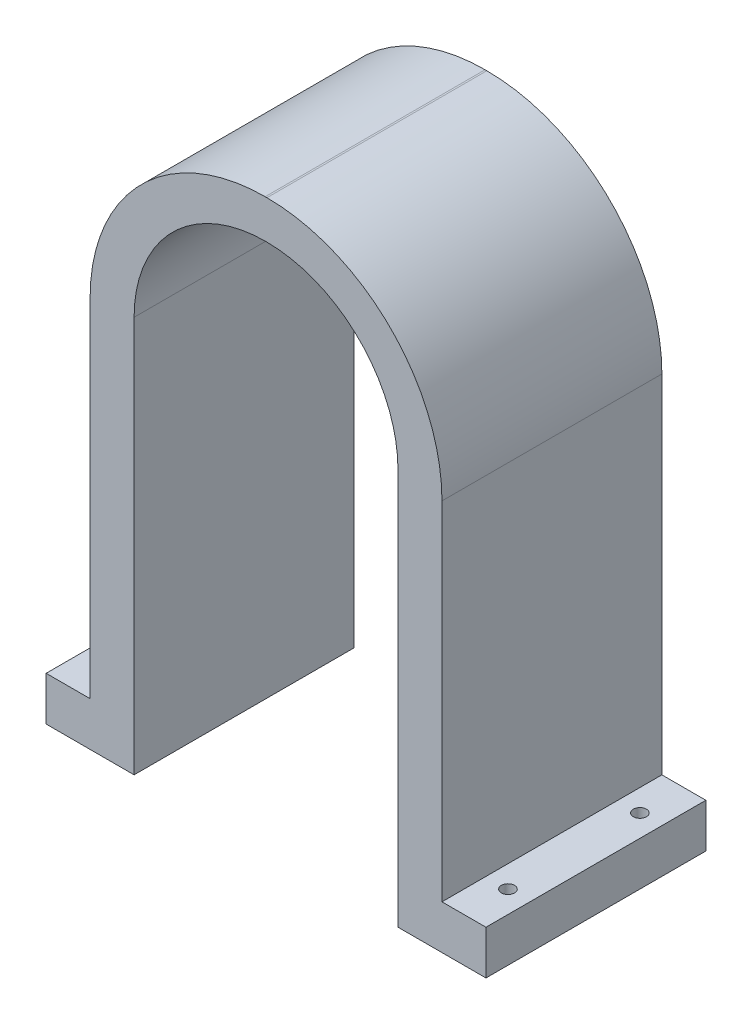
ISO-10303-21;
HEADER;
FILE_DESCRIPTION(('STEP AP214'),'2;1');
FILE_NAME('part.step','',(''),(''),'','','');
FILE_SCHEMA(('AUTOMOTIVE_DESIGN { 1 0 10303 214 1 1 1 1 }'));
ENDSEC;
DATA;
#1=APPLICATION_CONTEXT('core data for automotive mechanical design processes');
#2=APPLICATION_PROTOCOL_DEFINITION('international standard','automotive_design',2000,#1);
#3=PRODUCT_CONTEXT('',#1,'mechanical');
#4=PRODUCT('Part','Part','',(#3));
#5=PRODUCT_RELATED_PRODUCT_CATEGORY('part','',(#4));
#6=PRODUCT_DEFINITION_FORMATION('','',#4);
#7=PRODUCT_DEFINITION_CONTEXT('part definition',#1,'design');
#8=PRODUCT_DEFINITION('design','',#6,#7);
#9=PRODUCT_DEFINITION_SHAPE('','',#8);
#10=(LENGTH_UNIT() NAMED_UNIT(*) SI_UNIT(.MILLI.,.METRE.));
#11=(NAMED_UNIT(*) PLANE_ANGLE_UNIT() SI_UNIT($,.RADIAN.));
#12=(NAMED_UNIT(*) SI_UNIT($,.STERADIAN.) SOLID_ANGLE_UNIT());
#13=UNCERTAINTY_MEASURE_WITH_UNIT(LENGTH_MEASURE(1.E-05),#10,'distance_accuracy_value','');
#14=(GEOMETRIC_REPRESENTATION_CONTEXT(3) GLOBAL_UNCERTAINTY_ASSIGNED_CONTEXT((#13)) GLOBAL_UNIT_ASSIGNED_CONTEXT((#10,
#11,#12)) REPRESENTATION_CONTEXT('',''));
#15=CARTESIAN_POINT('',(0.,0.,0.));
#16=DIRECTION('',(0.,0.,1.));
#17=DIRECTION('',(1.,0.,0.));
#18=AXIS2_PLACEMENT_3D('',#15,#16,#17);
#19=CARTESIAN_POINT('',(-7.45283018867924,-1.23584905660377,50.));
#20=DIRECTION('',(0.,-1.,0.));
#21=DIRECTION('',(0.,0.,-1.));
#22=AXIS2_PLACEMENT_3D('',#19,#20,#21);
#23=PLANE('',#22);
#24=CARTESIAN_POINT('',(-2.45283018867924,-1.23584905660377,10.));
#25=DIRECTION('',(0.,1.,0.));
#26=DIRECTION('',(0.,0.,1.));
#27=AXIS2_PLACEMENT_3D('',#24,#25,#26);
#28=CIRCLE('',#27,1.5);
#29=CARTESIAN_POINT('',(-2.45283018867924,-1.23584905660377,11.5));
#30=VERTEX_POINT('',#29);
#31=EDGE_CURVE('E326',#30,#30,#28,.T.);
#32=ORIENTED_EDGE('',*,*,#31,.F.);
#33=EDGE_LOOP('',(#32));
#34=FACE_BOUND('',#33,.T.);
#35=CARTESIAN_POINT('',(-2.45283018867924,-1.23584905660377,40.));
#36=DIRECTION('',(0.,1.,0.));
#37=DIRECTION('',(0.,0.,1.));
#38=AXIS2_PLACEMENT_3D('',#35,#36,#37);
#39=CIRCLE('',#38,1.5);
#40=CARTESIAN_POINT('',(-2.45283018867924,-1.23584905660377,41.5));
#41=VERTEX_POINT('',#40);
#42=EDGE_CURVE('E262',#41,#41,#39,.T.);
#43=ORIENTED_EDGE('',*,*,#42,.F.);
#44=EDGE_LOOP('',(#43));
#45=FACE_BOUND('',#44,.T.);
#46=DIRECTION('',(-1.,0.,0.));
#47=VECTOR('',#46,1.);
#48=CARTESIAN_POINT('',(-7.45283018867924,-1.23584905660377,0.));
#49=LINE('',#48,#47);
#50=CARTESIAN_POINT('',(2.54716981132076,-1.23584905660377,0.));
#51=VERTEX_POINT('',#50);
#52=CARTESIAN_POINT('',(-7.45283018867924,-1.23584905660377,0.));
#53=VERTEX_POINT('',#52);
#54=EDGE_CURVE('E185',#51,#53,#49,.T.);
#55=ORIENTED_EDGE('',*,*,#54,.T.);
#56=DIRECTION('',(0.,0.,-1.));
#57=VECTOR('',#56,1.);
#58=CARTESIAN_POINT('',(-7.45283018867924,-1.23584905660377,50.));
#59=LINE('',#58,#57);
#60=CARTESIAN_POINT('',(-7.45283018867924,-1.23584905660377,50.));
#61=VERTEX_POINT('',#60);
#62=EDGE_CURVE('E11',#61,#53,#59,.T.);
#63=ORIENTED_EDGE('',*,*,#62,.F.);
#64=DIRECTION('',(-1.,0.,0.));
#65=VECTOR('',#64,1.);
#66=CARTESIAN_POINT('',(-7.45283018867924,-1.23584905660377,50.));
#67=LINE('',#66,#65);
#68=CARTESIAN_POINT('',(2.54716981132076,-1.23584905660377,50.));
#69=VERTEX_POINT('',#68);
#70=EDGE_CURVE('E215',#69,#61,#67,.T.);
#71=ORIENTED_EDGE('',*,*,#70,.F.);
#72=DIRECTION('',(0.,0.,-1.));
#73=VECTOR('',#72,1.);
#74=CARTESIAN_POINT('',(2.54716981132076,-1.23584905660377,50.));
#75=LINE('',#74,#73);
#76=EDGE_CURVE('E181',#69,#51,#75,.T.);
#77=ORIENTED_EDGE('',*,*,#76,.T.);
#78=EDGE_LOOP('',(#55,#63,#71,#77));
#79=FACE_BOUND('',#78,.T.);
#80=ADVANCED_FACE('F39',(#34,#45,#79),#23,.F.);
#81=CARTESIAN_POINT('',(-7.45283018867924,-1.23584905660377,50.));
#82=DIRECTION('',(1.,0.,0.));
#83=DIRECTION('',(0.,1.,0.));
#84=AXIS2_PLACEMENT_3D('',#81,#82,#83);
#85=PLANE('',#84);
#86=DIRECTION('',(0.,-1.,0.));
#87=VECTOR('',#86,1.);
#88=CARTESIAN_POINT('',(-7.45283018867924,-1.23584905660377,0.));
#89=LINE('',#88,#87);
#90=CARTESIAN_POINT('',(-7.45283018867924,-11.2358490566038,0.));
#91=VERTEX_POINT('',#90);
#92=EDGE_CURVE('E188',#53,#91,#89,.T.);
#93=ORIENTED_EDGE('',*,*,#92,.T.);
#94=DIRECTION('',(0.,0.,-1.));
#95=VECTOR('',#94,1.);
#96=CARTESIAN_POINT('',(-7.45283018867924,-11.2358490566038,50.));
#97=LINE('',#96,#95);
#98=CARTESIAN_POINT('',(-7.45283018867924,-11.2358490566038,50.));
#99=VERTEX_POINT('',#98);
#100=EDGE_CURVE('E48',#99,#91,#97,.T.);
#101=ORIENTED_EDGE('',*,*,#100,.F.);
#102=DIRECTION('',(0.,-1.,0.));
#103=VECTOR('',#102,1.);
#104=CARTESIAN_POINT('',(-7.45283018867924,-1.23584905660377,50.));
#105=LINE('',#104,#103);
#106=EDGE_CURVE('E124',#61,#99,#105,.T.);
#107=ORIENTED_EDGE('',*,*,#106,.F.);
#108=ORIENTED_EDGE('',*,*,#62,.T.);
#109=EDGE_LOOP('',(#93,#101,#107,#108));
#110=FACE_BOUND('',#109,.T.);
#111=ADVANCED_FACE('F315',(#110),#85,.F.);
#112=CARTESIAN_POINT('',(-7.45283018867924,-11.2358490566038,50.));
#113=DIRECTION('',(0.,1.,0.));
#114=DIRECTION('',(0.,0.,1.));
#115=AXIS2_PLACEMENT_3D('',#112,#113,#114);
#116=PLANE('',#115);
#117=CARTESIAN_POINT('',(-2.45283018867924,-11.2358490566038,10.));
#118=DIRECTION('',(0.,1.,0.));
#119=DIRECTION('',(0.,0.,1.));
#120=AXIS2_PLACEMENT_3D('',#117,#118,#119);
#121=CIRCLE('',#120,1.5);
#122=CARTESIAN_POINT('',(-2.45283018867924,-11.2358490566038,11.5));
#123=VERTEX_POINT('',#122);
#124=EDGE_CURVE('E42',#123,#123,#121,.T.);
#125=ORIENTED_EDGE('',*,*,#124,.T.);
#126=EDGE_LOOP('',(#125));
#127=FACE_BOUND('',#126,.T.);
#128=CARTESIAN_POINT('',(-2.45283018867924,-11.2358490566038,40.));
#129=DIRECTION('',(0.,1.,0.));
#130=DIRECTION('',(0.,0.,1.));
#131=AXIS2_PLACEMENT_3D('',#128,#129,#130);
#132=CIRCLE('',#131,1.5);
#133=CARTESIAN_POINT('',(-2.45283018867924,-11.2358490566038,41.5));
#134=VERTEX_POINT('',#133);
#135=EDGE_CURVE('E250',#134,#134,#132,.T.);
#136=ORIENTED_EDGE('',*,*,#135,.T.);
#137=EDGE_LOOP('',(#136));
#138=FACE_BOUND('',#137,.T.);
#139=DIRECTION('',(1.,0.,0.));
#140=VECTOR('',#139,1.);
#141=CARTESIAN_POINT('',(-7.45283018867924,-11.2358490566038,0.));
#142=LINE('',#141,#140);
#143=CARTESIAN_POINT('',(12.5471698113208,-11.2358490566038,0.));
#144=VERTEX_POINT('',#143);
#145=EDGE_CURVE('E190',#91,#144,#142,.T.);
#146=ORIENTED_EDGE('',*,*,#145,.T.);
#147=DIRECTION('',(0.,0.,-1.));
#148=VECTOR('',#147,1.);
#149=CARTESIAN_POINT('',(12.5471698113208,-11.2358490566038,50.));
#150=LINE('',#149,#148);
#151=CARTESIAN_POINT('',(12.5471698113208,-11.2358490566038,50.));
#152=VERTEX_POINT('',#151);
#153=EDGE_CURVE('E246',#152,#144,#150,.T.);
#154=ORIENTED_EDGE('',*,*,#153,.F.);
#155=DIRECTION('',(1.,0.,0.));
#156=VECTOR('',#155,1.);
#157=CARTESIAN_POINT('',(-7.45283018867924,-11.2358490566038,50.));
#158=LINE('',#157,#156);
#159=EDGE_CURVE('E268',#99,#152,#158,.T.);
#160=ORIENTED_EDGE('',*,*,#159,.F.);
#161=ORIENTED_EDGE('',*,*,#100,.T.);
#162=EDGE_LOOP('',(#146,#154,#160,#161));
#163=FACE_BOUND('',#162,.T.);
#164=ADVANCED_FACE('F322',(#127,#138,#163),#116,.F.);
#165=CARTESIAN_POINT('',(12.5471698113208,-11.2358490566038,50.));
#166=DIRECTION('',(-1.,0.,0.));
#167=DIRECTION('',(0.,0.,1.));
#168=AXIS2_PLACEMENT_3D('',#165,#166,#167);
#169=PLANE('',#168);
#170=DIRECTION('',(0.,1.,0.));
#171=VECTOR('',#170,1.);
#172=CARTESIAN_POINT('',(12.5471698113208,-11.2358490566038,0.));
#173=LINE('',#172,#171);
#174=CARTESIAN_POINT('',(12.5471698113208,78.8641509433962,0.));
#175=VERTEX_POINT('',#174);
#176=EDGE_CURVE('E192',#144,#175,#173,.T.);
#177=ORIENTED_EDGE('',*,*,#176,.T.);
#178=DIRECTION('',(0.,0.,-1.));
#179=VECTOR('',#178,1.);
#180=CARTESIAN_POINT('',(12.5471698113208,78.8641509433962,50.));
#181=LINE('',#180,#179);
#182=CARTESIAN_POINT('',(12.5471698113208,78.8641509433962,50.));
#183=VERTEX_POINT('',#182);
#184=EDGE_CURVE('E243',#183,#175,#181,.T.);
#185=ORIENTED_EDGE('',*,*,#184,.F.);
#186=DIRECTION('',(0.,1.,0.));
#187=VECTOR('',#186,1.);
#188=CARTESIAN_POINT('',(12.5471698113208,-11.2358490566038,50.));
#189=LINE('',#188,#187);
#190=EDGE_CURVE('E270',#152,#183,#189,.T.);
#191=ORIENTED_EDGE('',*,*,#190,.F.);
#192=ORIENTED_EDGE('',*,*,#153,.T.);
#193=EDGE_LOOP('',(#177,#185,#191,#192));
#194=FACE_BOUND('',#193,.T.);
#195=ADVANCED_FACE('F381',(#194),#169,.F.);
#196=CARTESIAN_POINT('',(42.4471698113208,78.8641509433962,50.));
#197=DIRECTION('',(0.,0.,-1.));
#198=DIRECTION('',(-1.,0.,0.));
#199=AXIS2_PLACEMENT_3D('',#196,#197,#198);
#200=CYLINDRICAL_SURFACE('',#199,29.9);
#201=CARTESIAN_POINT('',(42.4471698113208,78.8641509433962,0.));
#202=DIRECTION('',(0.,0.,-1.));
#203=DIRECTION('',(1.,0.,0.));
#204=AXIS2_PLACEMENT_3D('',#201,#202,#203);
#205=CIRCLE('',#204,29.9);
#206=CARTESIAN_POINT('',(42.4471698113208,108.764150943396,0.));
#207=VERTEX_POINT('',#206);
#208=EDGE_CURVE('E194',#175,#207,#205,.T.);
#209=ORIENTED_EDGE('',*,*,#208,.T.);
#210=DIRECTION('',(0.,0.,-1.));
#211=VECTOR('',#210,1.);
#212=CARTESIAN_POINT('',(42.4471698113208,108.764150943396,50.));
#213=LINE('',#212,#211);
#214=CARTESIAN_POINT('',(42.4471698113208,108.764150943396,50.));
#215=VERTEX_POINT('',#214);
#216=EDGE_CURVE('E240',#215,#207,#213,.T.);
#217=ORIENTED_EDGE('',*,*,#216,.F.);
#218=CARTESIAN_POINT('',(42.4471698113208,78.8641509433962,50.));
#219=DIRECTION('',(0.,0.,-1.));
#220=DIRECTION('',(1.,0.,0.));
#221=AXIS2_PLACEMENT_3D('',#218,#219,#220);
#222=CIRCLE('',#221,29.9);
#223=EDGE_CURVE('E272',#183,#215,#222,.T.);
#224=ORIENTED_EDGE('',*,*,#223,.F.);
#225=ORIENTED_EDGE('',*,*,#184,.T.);
#226=EDGE_LOOP('',(#209,#217,#224,#225));
#227=FACE_BOUND('',#226,.T.);
#228=ADVANCED_FACE('F377',(#227),#200,.F.);
#229=CARTESIAN_POINT('',(42.4471698113208,108.764150943396,50.));
#230=DIRECTION('',(0.,1.,0.));
#231=DIRECTION('',(0.,0.,1.));
#232=AXIS2_PLACEMENT_3D('',#229,#230,#231);
#233=PLANE('',#232);
#234=DIRECTION('',(1.,0.,0.));
#235=VECTOR('',#234,1.);
#236=CARTESIAN_POINT('',(42.4471698113208,108.764150943396,0.));
#237=LINE('',#236,#235);
#238=CARTESIAN_POINT('',(42.6471698113208,108.764150943396,0.));
#239=VERTEX_POINT('',#238);
#240=EDGE_CURVE('E196',#207,#239,#237,.T.);
#241=ORIENTED_EDGE('',*,*,#240,.T.);
#242=DIRECTION('',(0.,0.,-1.));
#243=VECTOR('',#242,1.);
#244=CARTESIAN_POINT('',(42.6471698113208,108.764150943396,50.));
#245=LINE('',#244,#243);
#246=CARTESIAN_POINT('',(42.6471698113208,108.764150943396,50.));
#247=VERTEX_POINT('',#246);
#248=EDGE_CURVE('E237',#247,#239,#245,.T.);
#249=ORIENTED_EDGE('',*,*,#248,.F.);
#250=DIRECTION('',(1.,0.,0.));
#251=VECTOR('',#250,1.);
#252=CARTESIAN_POINT('',(42.4471698113208,108.764150943396,50.));
#253=LINE('',#252,#251);
#254=EDGE_CURVE('E274',#215,#247,#253,.T.);
#255=ORIENTED_EDGE('',*,*,#254,.F.);
#256=ORIENTED_EDGE('',*,*,#216,.T.);
#257=EDGE_LOOP('',(#241,#249,#255,#256));
#258=FACE_BOUND('',#257,.T.);
#259=ADVANCED_FACE('F373',(#258),#233,.F.);
#260=CARTESIAN_POINT('',(42.6471698113208,78.8641509433962,50.));
#261=DIRECTION('',(0.,0.,-1.));
#262=DIRECTION('',(-1.,0.,0.));
#263=AXIS2_PLACEMENT_3D('',#260,#261,#262);
#264=CYLINDRICAL_SURFACE('',#263,29.9);
#265=CARTESIAN_POINT('',(42.6471698113208,78.8641509433962,0.));
#266=DIRECTION('',(0.,0.,-1.));
#267=DIRECTION('',(1.,0.,0.));
#268=AXIS2_PLACEMENT_3D('',#265,#266,#267);
#269=CIRCLE('',#268,29.9);
#270=CARTESIAN_POINT('',(72.5471698113208,78.8641509433962,0.));
#271=VERTEX_POINT('',#270);
#272=EDGE_CURVE('E198',#239,#271,#269,.T.);
#273=ORIENTED_EDGE('',*,*,#272,.T.);
#274=DIRECTION('',(0.,0.,-1.));
#275=VECTOR('',#274,1.);
#276=CARTESIAN_POINT('',(72.5471698113208,78.8641509433962,50.));
#277=LINE('',#276,#275);
#278=CARTESIAN_POINT('',(72.5471698113208,78.8641509433962,50.));
#279=VERTEX_POINT('',#278);
#280=EDGE_CURVE('E234',#279,#271,#277,.T.);
#281=ORIENTED_EDGE('',*,*,#280,.F.);
#282=CARTESIAN_POINT('',(42.6471698113208,78.8641509433962,50.));
#283=DIRECTION('',(0.,0.,-1.));
#284=DIRECTION('',(1.,0.,0.));
#285=AXIS2_PLACEMENT_3D('',#282,#283,#284);
#286=CIRCLE('',#285,29.9);
#287=EDGE_CURVE('E276',#247,#279,#286,.T.);
#288=ORIENTED_EDGE('',*,*,#287,.F.);
#289=ORIENTED_EDGE('',*,*,#248,.T.);
#290=EDGE_LOOP('',(#273,#281,#288,#289));
#291=FACE_BOUND('',#290,.T.);
#292=ADVANCED_FACE('F368',(#291),#264,.F.);
#293=CARTESIAN_POINT('',(72.5471698113208,-11.2358490566038,50.));
#294=DIRECTION('',(1.,0.,0.));
#295=DIRECTION('',(0.,1.,0.));
#296=AXIS2_PLACEMENT_3D('',#293,#294,#295);
#297=PLANE('',#296);
#298=DIRECTION('',(0.,-1.,0.));
#299=VECTOR('',#298,1.);
#300=CARTESIAN_POINT('',(72.5471698113208,-11.2358490566038,0.));
#301=LINE('',#300,#299);
#302=CARTESIAN_POINT('',(72.5471698113208,-11.2358490566038,0.));
#303=VERTEX_POINT('',#302);
#304=EDGE_CURVE('E200',#271,#303,#301,.T.);
#305=ORIENTED_EDGE('',*,*,#304,.T.);
#306=DIRECTION('',(0.,0.,-1.));
#307=VECTOR('',#306,1.);
#308=CARTESIAN_POINT('',(72.5471698113208,-11.2358490566038,50.));
#309=LINE('',#308,#307);
#310=CARTESIAN_POINT('',(72.5471698113208,-11.2358490566038,50.));
#311=VERTEX_POINT('',#310);
#312=EDGE_CURVE('E231',#311,#303,#309,.T.);
#313=ORIENTED_EDGE('',*,*,#312,.F.);
#314=DIRECTION('',(0.,-1.,0.));
#315=VECTOR('',#314,1.);
#316=CARTESIAN_POINT('',(72.5471698113208,-11.2358490566038,50.));
#317=LINE('',#316,#315);
#318=EDGE_CURVE('E278',#279,#311,#317,.T.);
#319=ORIENTED_EDGE('',*,*,#318,.F.);
#320=ORIENTED_EDGE('',*,*,#280,.T.);
#321=EDGE_LOOP('',(#305,#313,#319,#320));
#322=FACE_BOUND('',#321,.T.);
#323=ADVANCED_FACE('F362',(#322),#297,.F.);
#324=CARTESIAN_POINT('',(92.5471698113208,-11.2358490566038,50.));
#325=DIRECTION('',(0.,1.,0.));
#326=DIRECTION('',(-1.,0.,0.));
#327=AXIS2_PLACEMENT_3D('',#324,#325,#326);
#328=PLANE('',#327);
#329=CARTESIAN_POINT('',(87.5471698113208,-11.2358490566038,40.));
#330=DIRECTION('',(0.,1.,0.));
#331=DIRECTION('',(-1.,0.,0.));
#332=AXIS2_PLACEMENT_3D('',#329,#330,#331);
#333=CIRCLE('',#332,1.5);
#334=CARTESIAN_POINT('',(86.0471698113208,-11.2358490566038,40.));
#335=VERTEX_POINT('',#334);
#336=EDGE_CURVE('E252',#335,#335,#333,.T.);
#337=ORIENTED_EDGE('',*,*,#336,.T.);
#338=EDGE_LOOP('',(#337));
#339=FACE_BOUND('',#338,.T.);
#340=CARTESIAN_POINT('',(87.5471698113208,-11.2358490566038,10.));
#341=DIRECTION('',(0.,1.,0.));
#342=DIRECTION('',(-1.,0.,0.));
#343=AXIS2_PLACEMENT_3D('',#340,#341,#342);
#344=CIRCLE('',#343,1.5);
#345=CARTESIAN_POINT('',(86.0471698113208,-11.2358490566038,10.));
#346=VERTEX_POINT('',#345);
#347=EDGE_CURVE('E257',#346,#346,#344,.T.);
#348=ORIENTED_EDGE('',*,*,#347,.T.);
#349=EDGE_LOOP('',(#348));
#350=FACE_BOUND('',#349,.T.);
#351=DIRECTION('',(1.,0.,0.));
#352=VECTOR('',#351,1.);
#353=CARTESIAN_POINT('',(92.5471698113208,-11.2358490566038,0.));
#354=LINE('',#353,#352);
#355=CARTESIAN_POINT('',(92.5471698113208,-11.2358490566038,0.));
#356=VERTEX_POINT('',#355);
#357=EDGE_CURVE('E202',#303,#356,#354,.T.);
#358=ORIENTED_EDGE('',*,*,#357,.T.);
#359=DIRECTION('',(0.,0.,-1.));
#360=VECTOR('',#359,1.);
#361=CARTESIAN_POINT('',(92.5471698113208,-11.2358490566038,50.));
#362=LINE('',#361,#360);
#363=CARTESIAN_POINT('',(92.5471698113208,-11.2358490566038,50.));
#364=VERTEX_POINT('',#363);
#365=EDGE_CURVE('E228',#364,#356,#362,.T.);
#366=ORIENTED_EDGE('',*,*,#365,.F.);
#367=DIRECTION('',(1.,0.,0.));
#368=VECTOR('',#367,1.);
#369=CARTESIAN_POINT('',(92.5471698113208,-11.2358490566038,50.));
#370=LINE('',#369,#368);
#371=EDGE_CURVE('E280',#311,#364,#370,.T.);
#372=ORIENTED_EDGE('',*,*,#371,.F.);
#373=ORIENTED_EDGE('',*,*,#312,.T.);
#374=EDGE_LOOP('',(#358,#366,#372,#373));
#375=FACE_BOUND('',#374,.T.);
#376=ADVANCED_FACE('F358',(#339,#350,#375),#328,.F.);
#377=CARTESIAN_POINT('',(92.5471698113208,-1.23584905660377,50.));
#378=DIRECTION('',(-1.,0.,0.));
#379=DIRECTION('',(0.,0.,1.));
#380=AXIS2_PLACEMENT_3D('',#377,#378,#379);
#381=PLANE('',#380);
#382=DIRECTION('',(0.,1.,0.));
#383=VECTOR('',#382,1.);
#384=CARTESIAN_POINT('',(92.5471698113208,-1.23584905660377,0.));
#385=LINE('',#384,#383);
#386=CARTESIAN_POINT('',(92.5471698113208,-1.23584905660377,0.));
#387=VERTEX_POINT('',#386);
#388=EDGE_CURVE('E204',#356,#387,#385,.T.);
#389=ORIENTED_EDGE('',*,*,#388,.T.);
#390=DIRECTION('',(0.,0.,-1.));
#391=VECTOR('',#390,1.);
#392=CARTESIAN_POINT('',(92.5471698113208,-1.23584905660377,50.));
#393=LINE('',#392,#391);
#394=CARTESIAN_POINT('',(92.5471698113208,-1.23584905660377,50.));
#395=VERTEX_POINT('',#394);
#396=EDGE_CURVE('E225',#395,#387,#393,.T.);
#397=ORIENTED_EDGE('',*,*,#396,.F.);
#398=DIRECTION('',(0.,1.,0.));
#399=VECTOR('',#398,1.);
#400=CARTESIAN_POINT('',(92.5471698113208,-1.23584905660377,50.));
#401=LINE('',#400,#399);
#402=EDGE_CURVE('E282',#364,#395,#401,.T.);
#403=ORIENTED_EDGE('',*,*,#402,.F.);
#404=ORIENTED_EDGE('',*,*,#365,.T.);
#405=EDGE_LOOP('',(#389,#397,#403,#404));
#406=FACE_BOUND('',#405,.T.);
#407=ADVANCED_FACE('F345',(#406),#381,.F.);
#408=CARTESIAN_POINT('',(82.5471698113208,-1.23584905660377,50.));
#409=DIRECTION('',(0.,-1.,0.));
#410=DIRECTION('',(0.,0.,-1.));
#411=AXIS2_PLACEMENT_3D('',#408,#409,#410);
#412=PLANE('',#411);
#413=CARTESIAN_POINT('',(87.5471698113208,-1.23584905660377,40.));
#414=DIRECTION('',(0.,1.,0.));
#415=DIRECTION('',(0.,0.,1.));
#416=AXIS2_PLACEMENT_3D('',#413,#414,#415);
#417=CIRCLE('',#416,1.5);
#418=CARTESIAN_POINT('',(87.5471698113208,-1.23584905660377,41.5));
#419=VERTEX_POINT('',#418);
#420=EDGE_CURVE('E333',#419,#419,#417,.T.);
#421=ORIENTED_EDGE('',*,*,#420,.F.);
#422=EDGE_LOOP('',(#421));
#423=FACE_BOUND('',#422,.T.);
#424=CARTESIAN_POINT('',(87.5471698113208,-1.23584905660377,10.));
#425=DIRECTION('',(0.,1.,0.));
#426=DIRECTION('',(0.,0.,1.));
#427=AXIS2_PLACEMENT_3D('',#424,#425,#426);
#428=CIRCLE('',#427,1.5);
#429=CARTESIAN_POINT('',(87.5471698113208,-1.23584905660377,11.5));
#430=VERTEX_POINT('',#429);
#431=EDGE_CURVE('E330',#430,#430,#428,.T.);
#432=ORIENTED_EDGE('',*,*,#431,.F.);
#433=EDGE_LOOP('',(#432));
#434=FACE_BOUND('',#433,.T.);
#435=DIRECTION('',(-1.,0.,0.));
#436=VECTOR('',#435,1.);
#437=CARTESIAN_POINT('',(82.5471698113208,-1.23584905660377,0.));
#438=LINE('',#437,#436);
#439=CARTESIAN_POINT('',(82.5471698113208,-1.23584905660377,0.));
#440=VERTEX_POINT('',#439);
#441=EDGE_CURVE('E206',#387,#440,#438,.T.);
#442=ORIENTED_EDGE('',*,*,#441,.T.);
#443=DIRECTION('',(0.,0.,-1.));
#444=VECTOR('',#443,1.);
#445=CARTESIAN_POINT('',(82.5471698113208,-1.23584905660377,50.));
#446=LINE('',#445,#444);
#447=CARTESIAN_POINT('',(82.5471698113208,-1.23584905660377,50.));
#448=VERTEX_POINT('',#447);
#449=EDGE_CURVE('E222',#448,#440,#446,.T.);
#450=ORIENTED_EDGE('',*,*,#449,.F.);
#451=DIRECTION('',(-1.,0.,0.));
#452=VECTOR('',#451,1.);
#453=CARTESIAN_POINT('',(82.5471698113208,-1.23584905660377,50.));
#454=LINE('',#453,#452);
#455=EDGE_CURVE('E284',#395,#448,#454,.T.);
#456=ORIENTED_EDGE('',*,*,#455,.F.);
#457=ORIENTED_EDGE('',*,*,#396,.T.);
#458=EDGE_LOOP('',(#442,#450,#456,#457));
#459=FACE_BOUND('',#458,.T.);
#460=ADVANCED_FACE('F342',(#423,#434,#459),#412,.F.);
#461=CARTESIAN_POINT('',(82.5471698113208,-1.23584905660377,50.));
#462=DIRECTION('',(-1.,0.,0.));
#463=DIRECTION('',(0.,0.,1.));
#464=AXIS2_PLACEMENT_3D('',#461,#462,#463);
#465=PLANE('',#464);
#466=DIRECTION('',(0.,1.,0.));
#467=VECTOR('',#466,1.);
#468=CARTESIAN_POINT('',(82.5471698113208,-1.23584905660377,0.));
#469=LINE('',#468,#467);
#470=CARTESIAN_POINT('',(82.5471698113208,77.7041315010133,0.));
#471=VERTEX_POINT('',#470);
#472=EDGE_CURVE('E208',#440,#471,#469,.T.);
#473=ORIENTED_EDGE('',*,*,#472,.T.);
#474=DIRECTION('',(0.,0.,-1.));
#475=VECTOR('',#474,1.);
#476=CARTESIAN_POINT('',(82.5471698113208,77.7041315010133,50.));
#477=LINE('',#476,#475);
#478=CARTESIAN_POINT('',(82.5471698113208,77.7041315010133,50.));
#479=VERTEX_POINT('',#478);
#480=EDGE_CURVE('E219',#479,#471,#477,.T.);
#481=ORIENTED_EDGE('',*,*,#480,.F.);
#482=DIRECTION('',(0.,1.,0.));
#483=VECTOR('',#482,1.);
#484=CARTESIAN_POINT('',(82.5471698113208,-1.23584905660377,50.));
#485=LINE('',#484,#483);
#486=EDGE_CURVE('E286',#448,#479,#485,.T.);
#487=ORIENTED_EDGE('',*,*,#486,.F.);
#488=ORIENTED_EDGE('',*,*,#449,.T.);
#489=EDGE_LOOP('',(#473,#481,#487,#488));
#490=FACE_BOUND('',#489,.T.);
#491=ADVANCED_FACE('F292',(#490),#465,.F.);
#492=CARTESIAN_POINT('',(42.7471698113208,77.7041315010133,50.));
#493=DIRECTION('',(0.,0.,-1.));
#494=DIRECTION('',(-1.,0.,0.));
#495=AXIS2_PLACEMENT_3D('',#492,#493,#494);
#496=CYLINDRICAL_SURFACE('',#495,39.8);
#497=CARTESIAN_POINT('',(42.7471698113208,77.7041315010133,0.));
#498=DIRECTION('',(0.,0.,1.));
#499=DIRECTION('',(1.,0.,0.));
#500=AXIS2_PLACEMENT_3D('',#497,#498,#499);
#501=CIRCLE('',#500,39.8);
#502=CARTESIAN_POINT('',(42.7471698113208,117.504131501013,0.));
#503=VERTEX_POINT('',#502);
#504=EDGE_CURVE('E210',#471,#503,#501,.T.);
#505=ORIENTED_EDGE('',*,*,#504,.T.);
#506=DIRECTION('',(0.,0.,-1.));
#507=VECTOR('',#506,1.);
#508=CARTESIAN_POINT('',(42.7471698113208,117.504131501013,50.));
#509=LINE('',#508,#507);
#510=CARTESIAN_POINT('',(42.7471698113208,117.504131501013,50.));
#511=VERTEX_POINT('',#510);
#512=EDGE_CURVE('E176',#511,#503,#509,.T.);
#513=ORIENTED_EDGE('',*,*,#512,.F.);
#514=CARTESIAN_POINT('',(42.7471698113208,77.7041315010133,50.));
#515=DIRECTION('',(0.,0.,1.));
#516=DIRECTION('',(1.,0.,0.));
#517=AXIS2_PLACEMENT_3D('',#514,#515,#516);
#518=CIRCLE('',#517,39.8);
#519=EDGE_CURVE('E167',#479,#511,#518,.T.);
#520=ORIENTED_EDGE('',*,*,#519,.F.);
#521=ORIENTED_EDGE('',*,*,#480,.T.);
#522=EDGE_LOOP('',(#505,#513,#520,#521));
#523=FACE_BOUND('',#522,.T.);
#524=ADVANCED_FACE('F296',(#523),#496,.T.);
#525=CARTESIAN_POINT('',(42.3471698113208,117.504131501013,50.));
#526=DIRECTION('',(0.,-1.,0.));
#527=DIRECTION('',(1.,0.,0.));
#528=AXIS2_PLACEMENT_3D('',#525,#526,#527);
#529=PLANE('',#528);
#530=DIRECTION('',(-1.,0.,0.));
#531=VECTOR('',#530,1.);
#532=CARTESIAN_POINT('',(42.3471698113208,117.504131501013,0.));
#533=LINE('',#532,#531);
#534=CARTESIAN_POINT('',(42.3471698113208,117.504131501013,0.));
#535=VERTEX_POINT('',#534);
#536=EDGE_CURVE('E175',#503,#535,#533,.T.);
#537=ORIENTED_EDGE('',*,*,#536,.T.);
#538=DIRECTION('',(0.,0.,-1.));
#539=VECTOR('',#538,1.);
#540=CARTESIAN_POINT('',(42.3471698113208,117.504131501013,50.));
#541=LINE('',#540,#539);
#542=CARTESIAN_POINT('',(42.3471698113208,117.504131501013,50.));
#543=VERTEX_POINT('',#542);
#544=EDGE_CURVE('E172',#543,#535,#541,.T.);
#545=ORIENTED_EDGE('',*,*,#544,.F.);
#546=DIRECTION('',(-1.,0.,0.));
#547=VECTOR('',#546,1.);
#548=CARTESIAN_POINT('',(42.3471698113208,117.504131501013,50.));
#549=LINE('',#548,#547);
#550=EDGE_CURVE('E161',#511,#543,#549,.T.);
#551=ORIENTED_EDGE('',*,*,#550,.F.);
#552=ORIENTED_EDGE('',*,*,#512,.T.);
#553=EDGE_LOOP('',(#537,#545,#551,#552));
#554=FACE_BOUND('',#553,.T.);
#555=ADVANCED_FACE('F173',(#554),#529,.F.);
#556=CARTESIAN_POINT('',(42.3471698113208,77.7041315010133,50.));
#557=DIRECTION('',(0.,0.,-1.));
#558=DIRECTION('',(-1.,0.,0.));
#559=AXIS2_PLACEMENT_3D('',#556,#557,#558);
#560=CYLINDRICAL_SURFACE('',#559,39.8);
#561=CARTESIAN_POINT('',(42.3471698113208,77.7041315010133,0.));
#562=DIRECTION('',(0.,0.,1.));
#563=DIRECTION('',(1.,0.,0.));
#564=AXIS2_PLACEMENT_3D('',#561,#562,#563);
#565=CIRCLE('',#564,39.8);
#566=CARTESIAN_POINT('',(2.54716981132076,77.7041315010133,0.));
#567=VERTEX_POINT('',#566);
#568=EDGE_CURVE('E110',#535,#567,#565,.T.);
#569=ORIENTED_EDGE('',*,*,#568,.T.);
#570=DIRECTION('',(0.,0.,-1.));
#571=VECTOR('',#570,1.);
#572=CARTESIAN_POINT('',(2.54716981132076,77.7041315010133,50.));
#573=LINE('',#572,#571);
#574=CARTESIAN_POINT('',(2.54716981132076,77.7041315010133,50.));
#575=VERTEX_POINT('',#574);
#576=EDGE_CURVE('E177',#575,#567,#573,.T.);
#577=ORIENTED_EDGE('',*,*,#576,.F.);
#578=CARTESIAN_POINT('',(42.3471698113208,77.7041315010133,50.));
#579=DIRECTION('',(0.,0.,1.));
#580=DIRECTION('',(1.,0.,0.));
#581=AXIS2_PLACEMENT_3D('',#578,#579,#580);
#582=CIRCLE('',#581,39.8);
#583=EDGE_CURVE('E165',#543,#575,#582,.T.);
#584=ORIENTED_EDGE('',*,*,#583,.F.);
#585=ORIENTED_EDGE('',*,*,#544,.T.);
#586=EDGE_LOOP('',(#569,#577,#584,#585));
#587=FACE_BOUND('',#586,.T.);
#588=ADVANCED_FACE('F179',(#587),#560,.T.);
#589=CARTESIAN_POINT('',(2.54716981132076,-1.23584905660377,50.));
#590=DIRECTION('',(1.,0.,0.));
#591=DIRECTION('',(0.,1.,0.));
#592=AXIS2_PLACEMENT_3D('',#589,#590,#591);
#593=PLANE('',#592);
#594=DIRECTION('',(0.,-1.,0.));
#595=VECTOR('',#594,1.);
#596=CARTESIAN_POINT('',(2.54716981132076,-1.23584905660377,0.));
#597=LINE('',#596,#595);
#598=EDGE_CURVE('E116',#567,#51,#597,.T.);
#599=ORIENTED_EDGE('',*,*,#598,.T.);
#600=ORIENTED_EDGE('',*,*,#76,.F.);
#601=DIRECTION('',(0.,-1.,0.));
#602=VECTOR('',#601,1.);
#603=CARTESIAN_POINT('',(2.54716981132076,-1.23584905660377,50.));
#604=LINE('',#603,#602);
#605=EDGE_CURVE('E57',#575,#69,#604,.T.);
#606=ORIENTED_EDGE('',*,*,#605,.F.);
#607=ORIENTED_EDGE('',*,*,#576,.T.);
#608=EDGE_LOOP('',(#599,#600,#606,#607));
#609=FACE_BOUND('',#608,.T.);
#610=ADVANCED_FACE('F304',(#609),#593,.F.);
#611=CARTESIAN_POINT('',(42.3471698113208,77.7041315010133,50.));
#612=DIRECTION('',(0.,0.,1.));
#613=DIRECTION('',(1.,0.,0.));
#614=AXIS2_PLACEMENT_3D('',#611,#612,#613);
#615=PLANE('',#614);
#616=ORIENTED_EDGE('',*,*,#70,.T.);
#617=ORIENTED_EDGE('',*,*,#106,.T.);
#618=ORIENTED_EDGE('',*,*,#159,.T.);
#619=ORIENTED_EDGE('',*,*,#190,.T.);
#620=ORIENTED_EDGE('',*,*,#223,.T.);
#621=ORIENTED_EDGE('',*,*,#254,.T.);
#622=ORIENTED_EDGE('',*,*,#287,.T.);
#623=ORIENTED_EDGE('',*,*,#318,.T.);
#624=ORIENTED_EDGE('',*,*,#371,.T.);
#625=ORIENTED_EDGE('',*,*,#402,.T.);
#626=ORIENTED_EDGE('',*,*,#455,.T.);
#627=ORIENTED_EDGE('',*,*,#486,.T.);
#628=ORIENTED_EDGE('',*,*,#519,.T.);
#629=ORIENTED_EDGE('',*,*,#550,.T.);
#630=ORIENTED_EDGE('',*,*,#583,.T.);
#631=ORIENTED_EDGE('',*,*,#605,.T.);
#632=EDGE_LOOP('',(#616,#617,#618,#619,#620,#621,#622,#623,#624,#625,#626,#627,#628,#629,#630,#631));
#633=FACE_BOUND('',#632,.T.);
#634=ADVANCED_FACE('F163',(#633),#615,.T.);
#635=CARTESIAN_POINT('',(42.3471698113208,77.7041315010133,0.));
#636=DIRECTION('',(0.,0.,1.));
#637=DIRECTION('',(1.,0.,0.));
#638=AXIS2_PLACEMENT_3D('',#635,#636,#637);
#639=PLANE('',#638);
#640=ORIENTED_EDGE('',*,*,#54,.F.);
#641=ORIENTED_EDGE('',*,*,#598,.F.);
#642=ORIENTED_EDGE('',*,*,#568,.F.);
#643=ORIENTED_EDGE('',*,*,#536,.F.);
#644=ORIENTED_EDGE('',*,*,#504,.F.);
#645=ORIENTED_EDGE('',*,*,#472,.F.);
#646=ORIENTED_EDGE('',*,*,#441,.F.);
#647=ORIENTED_EDGE('',*,*,#388,.F.);
#648=ORIENTED_EDGE('',*,*,#357,.F.);
#649=ORIENTED_EDGE('',*,*,#304,.F.);
#650=ORIENTED_EDGE('',*,*,#272,.F.);
#651=ORIENTED_EDGE('',*,*,#240,.F.);
#652=ORIENTED_EDGE('',*,*,#208,.F.);
#653=ORIENTED_EDGE('',*,*,#176,.F.);
#654=ORIENTED_EDGE('',*,*,#145,.F.);
#655=ORIENTED_EDGE('',*,*,#92,.F.);
#656=EDGE_LOOP('',(#640,#641,#642,#643,#644,#645,#646,#647,#648,#649,#650,#651,#652,#653,#654,#655));
#657=FACE_BOUND('',#656,.T.);
#658=ADVANCED_FACE('F299',(#657),#639,.F.);
#659=CARTESIAN_POINT('',(87.5471698113208,-51.2358490566038,10.));
#660=DIRECTION('',(0.,1.,0.));
#661=DIRECTION('',(0.,0.,1.));
#662=AXIS2_PLACEMENT_3D('',#659,#660,#661);
#663=CYLINDRICAL_SURFACE('',#662,1.5);
#664=ORIENTED_EDGE('',*,*,#431,.T.);
#665=EDGE_LOOP('',(#664));
#666=FACE_BOUND('',#665,.T.);
#667=ORIENTED_EDGE('',*,*,#347,.F.);
#668=EDGE_LOOP('',(#667));
#669=FACE_BOUND('',#668,.T.);
#670=ADVANCED_FACE('F339',(#666,#669),#663,.F.);
#671=CARTESIAN_POINT('',(87.5471698113208,-51.2358490566038,40.));
#672=DIRECTION('',(0.,1.,0.));
#673=DIRECTION('',(0.,0.,1.));
#674=AXIS2_PLACEMENT_3D('',#671,#672,#673);
#675=CYLINDRICAL_SURFACE('',#674,1.5);
#676=ORIENTED_EDGE('',*,*,#420,.T.);
#677=EDGE_LOOP('',(#676));
#678=FACE_BOUND('',#677,.T.);
#679=ORIENTED_EDGE('',*,*,#336,.F.);
#680=EDGE_LOOP('',(#679));
#681=FACE_BOUND('',#680,.T.);
#682=ADVANCED_FACE('F445',(#678,#681),#675,.F.);
#683=CARTESIAN_POINT('',(-2.45283018867924,-51.2358490566038,40.));
#684=DIRECTION('',(0.,1.,0.));
#685=DIRECTION('',(0.,0.,1.));
#686=AXIS2_PLACEMENT_3D('',#683,#684,#685);
#687=CYLINDRICAL_SURFACE('',#686,1.5);
#688=ORIENTED_EDGE('',*,*,#42,.T.);
#689=EDGE_LOOP('',(#688));
#690=FACE_BOUND('',#689,.T.);
#691=ORIENTED_EDGE('',*,*,#135,.F.);
#692=EDGE_LOOP('',(#691));
#693=FACE_BOUND('',#692,.T.);
#694=ADVANCED_FACE('F454',(#690,#693),#687,.F.);
#695=CARTESIAN_POINT('',(-2.45283018867924,-51.2358490566038,10.));
#696=DIRECTION('',(0.,1.,0.));
#697=DIRECTION('',(0.,0.,1.));
#698=AXIS2_PLACEMENT_3D('',#695,#696,#697);
#699=CYLINDRICAL_SURFACE('',#698,1.5);
#700=ORIENTED_EDGE('',*,*,#31,.T.);
#701=EDGE_LOOP('',(#700));
#702=FACE_BOUND('',#701,.T.);
#703=ORIENTED_EDGE('',*,*,#124,.F.);
#704=EDGE_LOOP('',(#703));
#705=FACE_BOUND('',#704,.T.);
#706=ADVANCED_FACE('F464',(#702,#705),#699,.F.);
#707=CLOSED_SHELL('',(#80,#111,#164,#195,#228,#259,#292,#323,#376,#407,#460,#491,#524,#555,#588,
#610,#634,#658,#670,#682,#694,#706));
#708=MANIFOLD_SOLID_BREP('B2',#707);
#709=ADVANCED_BREP_SHAPE_REPRESENTATION('',(#18,#708),#14);
#710=SHAPE_DEFINITION_REPRESENTATION(#9,#709);
ENDSEC;
END-ISO-10303-21;
